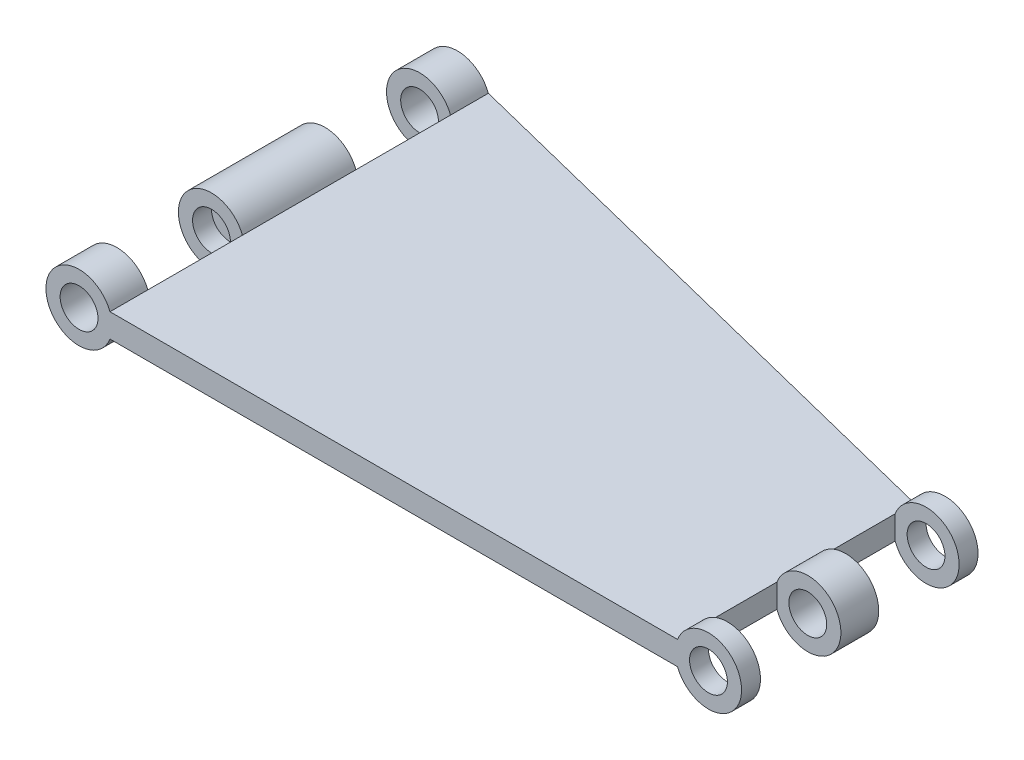
ISO-10303-21;
HEADER;
FILE_DESCRIPTION(('STEP AP214'),'2;1');
FILE_NAME('part.step','',(''),(''),'','','');
FILE_SCHEMA(('AUTOMOTIVE_DESIGN { 1 0 10303 214 1 1 1 1 }'));
ENDSEC;
DATA;
#1=APPLICATION_CONTEXT('core data for automotive mechanical design processes');
#2=APPLICATION_PROTOCOL_DEFINITION('international standard','automotive_design',2000,#1);
#3=PRODUCT_CONTEXT('',#1,'mechanical');
#4=PRODUCT('Part','Part','',(#3));
#5=PRODUCT_RELATED_PRODUCT_CATEGORY('part','',(#4));
#6=PRODUCT_DEFINITION_FORMATION('','',#4);
#7=PRODUCT_DEFINITION_CONTEXT('part definition',#1,'design');
#8=PRODUCT_DEFINITION('design','',#6,#7);
#9=PRODUCT_DEFINITION_SHAPE('','',#8);
#10=(LENGTH_UNIT() NAMED_UNIT(*) SI_UNIT(.MILLI.,.METRE.));
#11=(NAMED_UNIT(*) PLANE_ANGLE_UNIT() SI_UNIT($,.RADIAN.));
#12=(NAMED_UNIT(*) SI_UNIT($,.STERADIAN.) SOLID_ANGLE_UNIT());
#13=UNCERTAINTY_MEASURE_WITH_UNIT(LENGTH_MEASURE(1.E-05),#10,'distance_accuracy_value','');
#14=(GEOMETRIC_REPRESENTATION_CONTEXT(3) GLOBAL_UNCERTAINTY_ASSIGNED_CONTEXT((#13)) GLOBAL_UNIT_ASSIGNED_CONTEXT((#10,
#11,#12)) REPRESENTATION_CONTEXT('',''));
#15=CARTESIAN_POINT('',(0.,0.,0.));
#16=DIRECTION('',(0.,0.,1.));
#17=DIRECTION('',(1.,0.,0.));
#18=AXIS2_PLACEMENT_3D('',#15,#16,#17);
#19=CARTESIAN_POINT('',(-86.030948838144,2.5,-46.9344608879492));
#20=DIRECTION('',(0.,0.,1.));
#21=DIRECTION('',(1.,0.,0.));
#22=AXIS2_PLACEMENT_3D('',#19,#20,#21);
#23=CYLINDRICAL_SURFACE('',#22,1.5);
#24=CARTESIAN_POINT('',(-86.030948838144,2.5,1.0655391120508));
#25=DIRECTION('',(0.,0.,1.));
#26=DIRECTION('',(1.,0.,0.));
#27=AXIS2_PLACEMENT_3D('',#24,#25,#26);
#28=CIRCLE('',#27,1.5);
#29=CARTESIAN_POINT('',(-84.530948838144,2.5,1.0655391120508));
#30=VERTEX_POINT('',#29);
#31=EDGE_CURVE('E198',#30,#30,#28,.F.);
#32=ORIENTED_EDGE('',*,*,#31,.F.);
#33=EDGE_LOOP('',(#32));
#34=FACE_BOUND('',#33,.T.);
#35=CARTESIAN_POINT('',(-86.030948838144,2.5,-14.9344608879492));
#36=DIRECTION('',(0.,0.,-1.));
#37=DIRECTION('',(-1.,0.,0.));
#38=AXIS2_PLACEMENT_3D('',#35,#36,#37);
#39=CIRCLE('',#38,1.5);
#40=CARTESIAN_POINT('',(-87.530948838144,2.5,-14.9344608879492));
#41=VERTEX_POINT('',#40);
#42=EDGE_CURVE('E39',#41,#41,#39,.F.);
#43=ORIENTED_EDGE('',*,*,#42,.F.);
#44=EDGE_LOOP('',(#43));
#45=FACE_BOUND('',#44,.T.);
#46=ADVANCED_FACE('F35',(#34,#45),#23,.F.);
#47=CARTESIAN_POINT('',(47.045747992478,2.5,-16.9344608879492));
#48=DIRECTION('',(0.,0.,1.));
#49=DIRECTION('',(1.,0.,0.));
#50=AXIS2_PLACEMENT_3D('',#47,#48,#49);
#51=CYLINDRICAL_SURFACE('',#50,7.);
#52=DIRECTION('',(0.,0.,-1.));
#53=VECTOR('',#52,1.);
#54=CARTESIAN_POINT('',(40.507399577167,0.,33.0655391120508));
#55=LINE('',#54,#53);
#56=CARTESIAN_POINT('',(40.507399577167,0.,12.0655391120508));
#57=VERTEX_POINT('',#56);
#58=CARTESIAN_POINT('',(40.507399577167,0.,4.0655391120508));
#59=VERTEX_POINT('',#58);
#60=EDGE_CURVE('E405',#57,#59,#55,.T.);
#61=ORIENTED_EDGE('',*,*,#60,.T.);
#62=CARTESIAN_POINT('',(47.045747992478,2.5,4.0655391120508));
#63=DIRECTION('',(0.,0.,-1.));
#64=DIRECTION('',(-1.,0.,0.));
#65=AXIS2_PLACEMENT_3D('',#62,#63,#64);
#66=CIRCLE('',#65,7.);
#67=CARTESIAN_POINT('',(40.507399577167,5.00000000000001,4.0655391120508));
#68=VERTEX_POINT('',#67);
#69=EDGE_CURVE('E155',#59,#68,#66,.F.);
#70=ORIENTED_EDGE('',*,*,#69,.T.);
#71=DIRECTION('',(0.,0.,-1.));
#72=VECTOR('',#71,1.);
#73=CARTESIAN_POINT('',(40.507399577167,5.,33.0655391120508));
#74=LINE('',#73,#72);
#75=CARTESIAN_POINT('',(40.507399577167,5.00000000000001,12.0655391120508));
#76=VERTEX_POINT('',#75);
#77=EDGE_CURVE('E153',#76,#68,#74,.T.);
#78=ORIENTED_EDGE('',*,*,#77,.F.);
#79=CARTESIAN_POINT('',(47.045747992478,2.5,12.0655391120508));
#80=DIRECTION('',(0.,0.,1.));
#81=DIRECTION('',(1.,0.,0.));
#82=AXIS2_PLACEMENT_3D('',#79,#80,#81);
#83=CIRCLE('',#82,7.);
#84=EDGE_CURVE('E127',#76,#57,#83,.F.);
#85=ORIENTED_EDGE('',*,*,#84,.T.);
#86=EDGE_LOOP('',(#61,#70,#78,#85));
#87=FACE_BOUND('',#86,.T.);
#88=ADVANCED_FACE('F154',(#87),#51,.T.);
#89=CARTESIAN_POINT('',(47.045747992478,2.5,-12.9344608879492));
#90=DIRECTION('',(0.,0.,1.));
#91=DIRECTION('',(1.,0.,0.));
#92=AXIS2_PLACEMENT_3D('',#89,#90,#91);
#93=CIRCLE('',#92,7.);
#94=CARTESIAN_POINT('',(40.507399577167,5.00000000000001,-12.9344608879492));
#95=VERTEX_POINT('',#94);
#96=CARTESIAN_POINT('',(40.507399577167,0.,-12.9344608879492));
#97=VERTEX_POINT('',#96);
#98=EDGE_CURVE('E194',#95,#97,#93,.F.);
#99=ORIENTED_EDGE('',*,*,#98,.T.);
#100=CARTESIAN_POINT('',(40.507399577167,0.,-16.9344608879492));
#101=VERTEX_POINT('',#100);
#102=EDGE_CURVE('E180',#97,#101,#55,.T.);
#103=ORIENTED_EDGE('',*,*,#102,.T.);
#104=CARTESIAN_POINT('',(47.045747992478,2.5,-16.9344608879492));
#105=DIRECTION('',(0.,0.,1.));
#106=DIRECTION('',(1.,0.,0.));
#107=AXIS2_PLACEMENT_3D('',#104,#105,#106);
#108=CIRCLE('',#107,7.);
#109=CARTESIAN_POINT('',(40.507399577167,5.,-16.9344608879492));
#110=VERTEX_POINT('',#109);
#111=EDGE_CURVE('E243',#101,#110,#108,.T.);
#112=ORIENTED_EDGE('',*,*,#111,.T.);
#113=EDGE_CURVE('E165',#95,#110,#74,.T.);
#114=ORIENTED_EDGE('',*,*,#113,.F.);
#115=EDGE_LOOP('',(#99,#103,#112,#114));
#116=FACE_BOUND('',#115,.T.);
#117=ADVANCED_FACE('F323',(#116),#51,.T.);
#118=CARTESIAN_POINT('',(40.507399577167,0.,33.0655391120508));
#119=VERTEX_POINT('',#118);
#120=CARTESIAN_POINT('',(40.507399577167,0.,29.0655391120508));
#121=VERTEX_POINT('',#120);
#122=EDGE_CURVE('E181',#119,#121,#55,.T.);
#123=ORIENTED_EDGE('',*,*,#122,.T.);
#124=CARTESIAN_POINT('',(47.045747992478,2.5,29.0655391120508));
#125=DIRECTION('',(0.,0.,-1.));
#126=DIRECTION('',(-1.,0.,0.));
#127=AXIS2_PLACEMENT_3D('',#124,#125,#126);
#128=CIRCLE('',#127,7.);
#129=CARTESIAN_POINT('',(40.507399577167,5.00000000000001,29.0655391120508));
#130=VERTEX_POINT('',#129);
#131=EDGE_CURVE('E190',#121,#130,#128,.F.);
#132=ORIENTED_EDGE('',*,*,#131,.T.);
#133=CARTESIAN_POINT('',(40.507399577167,5.,33.0655391120508));
#134=VERTEX_POINT('',#133);
#135=EDGE_CURVE('E44',#134,#130,#74,.T.);
#136=ORIENTED_EDGE('',*,*,#135,.F.);
#137=CARTESIAN_POINT('',(47.045747992478,2.5,33.0655391120508));
#138=DIRECTION('',(0.,0.,1.));
#139=DIRECTION('',(1.,0.,0.));
#140=AXIS2_PLACEMENT_3D('',#137,#138,#139);
#141=CIRCLE('',#140,7.);
#142=EDGE_CURVE('E240',#119,#134,#141,.T.);
#143=ORIENTED_EDGE('',*,*,#142,.F.);
#144=EDGE_LOOP('',(#123,#132,#136,#143));
#145=FACE_BOUND('',#144,.T.);
#146=ADVANCED_FACE('F325',(#145),#51,.T.);
#147=CARTESIAN_POINT('',(47.045747992478,2.5,-16.9344608879492));
#148=DIRECTION('',(0.,0.,1.));
#149=DIRECTION('',(1.,0.,0.));
#150=AXIS2_PLACEMENT_3D('',#147,#148,#149);
#151=CYLINDRICAL_SURFACE('',#150,4.00000000000001);
#152=CARTESIAN_POINT('',(47.045747992478,2.5,-16.9344608879492));
#153=DIRECTION('',(0.,0.,1.));
#154=DIRECTION('',(1.,0.,0.));
#155=AXIS2_PLACEMENT_3D('',#152,#153,#154);
#156=CIRCLE('',#155,4.00000000000001);
#157=CARTESIAN_POINT('',(51.045747992478,2.5,-16.9344608879492));
#158=VERTEX_POINT('',#157);
#159=EDGE_CURVE('E237',#158,#158,#156,.T.);
#160=ORIENTED_EDGE('',*,*,#159,.F.);
#161=EDGE_LOOP('',(#160));
#162=FACE_BOUND('',#161,.T.);
#163=CARTESIAN_POINT('',(47.045747992478,2.5,-12.9344608879492));
#164=DIRECTION('',(0.,0.,1.));
#165=DIRECTION('',(1.,0.,0.));
#166=AXIS2_PLACEMENT_3D('',#163,#164,#165);
#167=CIRCLE('',#166,4.00000000000001);
#168=CARTESIAN_POINT('',(51.045747992478,2.5,-12.9344608879492));
#169=VERTEX_POINT('',#168);
#170=EDGE_CURVE('E191',#169,#169,#167,.F.);
#171=ORIENTED_EDGE('',*,*,#170,.F.);
#172=EDGE_LOOP('',(#171));
#173=FACE_BOUND('',#172,.T.);
#174=ADVANCED_FACE('F355',(#162,#173),#151,.F.);
#175=CARTESIAN_POINT('',(47.045747992478,2.5,33.0655391120508));
#176=DIRECTION('',(0.,0.,1.));
#177=DIRECTION('',(1.,0.,0.));
#178=AXIS2_PLACEMENT_3D('',#175,#176,#177);
#179=CIRCLE('',#178,4.00000000000001);
#180=CARTESIAN_POINT('',(51.045747992478,2.5,33.0655391120508));
#181=VERTEX_POINT('',#180);
#182=EDGE_CURVE('E236',#181,#181,#179,.T.);
#183=ORIENTED_EDGE('',*,*,#182,.T.);
#184=EDGE_LOOP('',(#183));
#185=FACE_BOUND('',#184,.T.);
#186=CARTESIAN_POINT('',(47.045747992478,2.5,29.0655391120508));
#187=DIRECTION('',(0.,0.,-1.));
#188=DIRECTION('',(-1.,0.,0.));
#189=AXIS2_PLACEMENT_3D('',#186,#187,#188);
#190=CIRCLE('',#189,4.00000000000001);
#191=CARTESIAN_POINT('',(43.045747992478,2.5,29.0655391120508));
#192=VERTEX_POINT('',#191);
#193=EDGE_CURVE('E137',#192,#192,#190,.F.);
#194=ORIENTED_EDGE('',*,*,#193,.F.);
#195=EDGE_LOOP('',(#194));
#196=FACE_BOUND('',#195,.T.);
#197=ADVANCED_FACE('F352',(#185,#196),#151,.F.);
#198=CARTESIAN_POINT('',(-86.030948838144,2.5,-46.9344608879492));
#199=DIRECTION('',(0.,0.,1.));
#200=DIRECTION('',(1.,0.,0.));
#201=AXIS2_PLACEMENT_3D('',#198,#199,#200);
#202=CYLINDRICAL_SURFACE('',#201,7.);
#203=DIRECTION('',(0.,0.,1.));
#204=VECTOR('',#203,1.);
#205=CARTESIAN_POINT('',(-79.492600422833,0.,-46.9344608879492));
#206=LINE('',#205,#204);
#207=CARTESIAN_POINT('',(-79.492600422833,0.,-46.9344608879492));
#208=VERTEX_POINT('',#207);
#209=CARTESIAN_POINT('',(-79.492600422833,0.,-38.9344608879492));
#210=VERTEX_POINT('',#209);
#211=EDGE_CURVE('E175',#208,#210,#206,.T.);
#212=ORIENTED_EDGE('',*,*,#211,.T.);
#213=CARTESIAN_POINT('',(-86.030948838144,2.5,-38.9344608879492));
#214=DIRECTION('',(0.,0.,1.));
#215=DIRECTION('',(1.,0.,0.));
#216=AXIS2_PLACEMENT_3D('',#213,#214,#215);
#217=CIRCLE('',#216,7.);
#218=CARTESIAN_POINT('',(-79.492600422833,5.,-38.9344608879492));
#219=VERTEX_POINT('',#218);
#220=EDGE_CURVE('E59',#210,#219,#217,.F.);
#221=ORIENTED_EDGE('',*,*,#220,.T.);
#222=DIRECTION('',(0.,0.,1.));
#223=VECTOR('',#222,1.);
#224=CARTESIAN_POINT('',(-79.492600422833,5.,-46.9344608879492));
#225=LINE('',#224,#223);
#226=CARTESIAN_POINT('',(-79.492600422833,5.,-46.9344608879492));
#227=VERTEX_POINT('',#226);
#228=EDGE_CURVE('E274',#227,#219,#225,.T.);
#229=ORIENTED_EDGE('',*,*,#228,.F.);
#230=CARTESIAN_POINT('',(-86.030948838144,2.5,-46.9344608879492));
#231=DIRECTION('',(0.,0.,1.));
#232=DIRECTION('',(1.,0.,0.));
#233=AXIS2_PLACEMENT_3D('',#230,#231,#232);
#234=CIRCLE('',#233,7.);
#235=EDGE_CURVE('E266',#227,#208,#234,.T.);
#236=ORIENTED_EDGE('',*,*,#235,.T.);
#237=EDGE_LOOP('',(#212,#221,#229,#236));
#238=FACE_BOUND('',#237,.T.);
#239=ADVANCED_FACE('F313',(#238),#202,.T.);
#240=CARTESIAN_POINT('',(-86.030948838144,2.5,-18.9344608879492));
#241=DIRECTION('',(0.,0.,1.));
#242=DIRECTION('',(1.,0.,0.));
#243=AXIS2_PLACEMENT_3D('',#240,#241,#242);
#244=CIRCLE('',#243,7.);
#245=CARTESIAN_POINT('',(-79.492600422833,0.,-18.9344608879492));
#246=VERTEX_POINT('',#245);
#247=CARTESIAN_POINT('',(-79.492600422833,5.,-18.9344608879492));
#248=VERTEX_POINT('',#247);
#249=EDGE_CURVE('E263',#246,#248,#244,.F.);
#250=ORIENTED_EDGE('',*,*,#249,.F.);
#251=CARTESIAN_POINT('',(-79.492600422833,0.,5.0655391120508));
#252=VERTEX_POINT('',#251);
#253=EDGE_CURVE('E292',#246,#252,#206,.T.);
#254=ORIENTED_EDGE('',*,*,#253,.T.);
#255=CARTESIAN_POINT('',(-86.030948838144,2.5,5.0655391120508));
#256=DIRECTION('',(0.,0.,1.));
#257=DIRECTION('',(1.,0.,0.));
#258=AXIS2_PLACEMENT_3D('',#255,#256,#257);
#259=CIRCLE('',#258,7.);
#260=CARTESIAN_POINT('',(-79.492600422833,5.,5.0655391120508));
#261=VERTEX_POINT('',#260);
#262=EDGE_CURVE('E260',#252,#261,#259,.F.);
#263=ORIENTED_EDGE('',*,*,#262,.T.);
#264=EDGE_CURVE('E278',#248,#261,#225,.T.);
#265=ORIENTED_EDGE('',*,*,#264,.F.);
#266=EDGE_LOOP('',(#250,#254,#263,#265));
#267=FACE_BOUND('',#266,.T.);
#268=ADVANCED_FACE('F289',(#267),#202,.T.);
#269=CARTESIAN_POINT('',(40.507399577167,5.,-16.9344608879492));
#270=DIRECTION('',(-0.242535625036333,0.,0.970142500145332));
#271=DIRECTION('',(0.970142500145332,0.,0.242535625036333));
#272=AXIS2_PLACEMENT_3D('',#269,#270,#271);
#273=PLANE('',#272);
#274=DIRECTION('',(-0.970142500145332,0.,-0.242535625036333));
#275=VECTOR('',#274,1.);
#276=CARTESIAN_POINT('',(40.507399577167,0.,-16.9344608879492));
#277=LINE('',#276,#275);
#278=EDGE_CURVE('E170',#101,#208,#277,.T.);
#279=ORIENTED_EDGE('',*,*,#278,.T.);
#280=CARTESIAN_POINT('',(-86.030948838144,2.5,-48.5690479917769));
#281=DIRECTION('',(-0.242535625036333,0.,0.970142500145332));
#282=DIRECTION('',(0.970142500145332,0.,0.242535625036333));
#283=AXIS2_PLACEMENT_3D('',#280,#281,#282);
#284=ELLIPSE('',#283,7.21543484483091,7.);
#285=EDGE_CURVE('E174',#208,#227,#284,.T.);
#286=ORIENTED_EDGE('',*,*,#285,.T.);
#287=DIRECTION('',(-0.970142500145332,0.,-0.242535625036333));
#288=VECTOR('',#287,1.);
#289=CARTESIAN_POINT('',(40.507399577167,5.,-16.9344608879492));
#290=LINE('',#289,#288);
#291=EDGE_CURVE('E183',#110,#227,#290,.T.);
#292=ORIENTED_EDGE('',*,*,#291,.F.);
#293=DIRECTION('',(0.,-1.,0.));
#294=VECTOR('',#293,1.);
#295=CARTESIAN_POINT('',(40.507399577167,5.,-16.9344608879492));
#296=LINE('',#295,#294);
#297=EDGE_CURVE('E11',#110,#101,#296,.T.);
#298=ORIENTED_EDGE('',*,*,#297,.T.);
#299=EDGE_LOOP('',(#279,#286,#292,#298));
#300=FACE_BOUND('',#299,.T.);
#301=ADVANCED_FACE('F37',(#300),#273,.F.);
#302=CARTESIAN_POINT('',(-79.492600422833,5.,33.0655391120508));
#303=DIRECTION('',(0.,0.,-1.));
#304=DIRECTION('',(-1.,0.,0.));
#305=AXIS2_PLACEMENT_3D('',#302,#303,#304);
#306=PLANE('',#305);
#307=CARTESIAN_POINT('',(-86.030948838144,2.5,33.0655391120508));
#308=DIRECTION('',(0.,0.,1.));
#309=DIRECTION('',(1.,0.,0.));
#310=AXIS2_PLACEMENT_3D('',#307,#308,#309);
#311=CIRCLE('',#310,4.00000000000001);
#312=CARTESIAN_POINT('',(-82.030948838144,2.5,33.0655391120508));
#313=VERTEX_POINT('',#312);
#314=EDGE_CURVE('E222',#313,#313,#311,.T.);
#315=ORIENTED_EDGE('',*,*,#314,.F.);
#316=EDGE_LOOP('',(#315));
#317=FACE_BOUND('',#316,.T.);
#318=DIRECTION('',(1.,0.,0.));
#319=VECTOR('',#318,1.);
#320=CARTESIAN_POINT('',(-79.492600422833,0.,33.0655391120508));
#321=LINE('',#320,#319);
#322=CARTESIAN_POINT('',(-79.492600422833,0.,33.0655391120508));
#323=VERTEX_POINT('',#322);
#324=EDGE_CURVE('E177',#323,#119,#321,.T.);
#325=ORIENTED_EDGE('',*,*,#324,.T.);
#326=ORIENTED_EDGE('',*,*,#142,.T.);
#327=DIRECTION('',(1.,0.,0.));
#328=VECTOR('',#327,1.);
#329=CARTESIAN_POINT('',(-79.492600422833,5.,33.0655391120508));
#330=LINE('',#329,#328);
#331=CARTESIAN_POINT('',(-79.492600422833,5.,33.0655391120508));
#332=VERTEX_POINT('',#331);
#333=EDGE_CURVE('E168',#332,#134,#330,.T.);
#334=ORIENTED_EDGE('',*,*,#333,.F.);
#335=CARTESIAN_POINT('',(-86.030948838144,2.5,33.0655391120508));
#336=DIRECTION('',(0.,0.,1.));
#337=DIRECTION('',(1.,0.,0.));
#338=AXIS2_PLACEMENT_3D('',#335,#336,#337);
#339=CIRCLE('',#338,7.);
#340=EDGE_CURVE('E265',#332,#323,#339,.T.);
#341=ORIENTED_EDGE('',*,*,#340,.T.);
#342=EDGE_LOOP('',(#325,#326,#334,#341));
#343=FACE_BOUND('',#342,.T.);
#344=ORIENTED_EDGE('',*,*,#182,.F.);
#345=EDGE_LOOP('',(#344));
#346=FACE_BOUND('',#345,.T.);
#347=ADVANCED_FACE('F336',(#317,#343,#346),#306,.F.);
#348=CARTESIAN_POINT('',(0.,5.,0.));
#349=DIRECTION('',(0.,1.,0.));
#350=DIRECTION('',(0.,0.,1.));
#351=AXIS2_PLACEMENT_3D('',#348,#349,#350);
#352=PLANE('',#351);
#353=ORIENTED_EDGE('',*,*,#291,.T.);
#354=ORIENTED_EDGE('',*,*,#228,.T.);
#355=EDGE_CURVE('E276',#219,#248,#225,.T.);
#356=ORIENTED_EDGE('',*,*,#355,.T.);
#357=ORIENTED_EDGE('',*,*,#264,.T.);
#358=CARTESIAN_POINT('',(-79.492600422833,5.,25.0655391120508));
#359=VERTEX_POINT('',#358);
#360=EDGE_CURVE('E279',#261,#359,#225,.T.);
#361=ORIENTED_EDGE('',*,*,#360,.T.);
#362=EDGE_CURVE('E273',#359,#332,#225,.T.);
#363=ORIENTED_EDGE('',*,*,#362,.T.);
#364=ORIENTED_EDGE('',*,*,#333,.T.);
#365=ORIENTED_EDGE('',*,*,#135,.T.);
#366=EDGE_CURVE('E145',#130,#76,#74,.T.);
#367=ORIENTED_EDGE('',*,*,#366,.T.);
#368=ORIENTED_EDGE('',*,*,#77,.T.);
#369=EDGE_CURVE('E159',#68,#95,#74,.T.);
#370=ORIENTED_EDGE('',*,*,#369,.T.);
#371=ORIENTED_EDGE('',*,*,#113,.T.);
#372=EDGE_LOOP('',(#353,#354,#356,#357,#361,#363,#364,#365,#367,#368,#370,#371));
#373=FACE_BOUND('',#372,.T.);
#374=ADVANCED_FACE('F163',(#373),#352,.T.);
#375=CARTESIAN_POINT('',(0.,0.,0.));
#376=DIRECTION('',(0.,1.,0.));
#377=DIRECTION('',(0.,0.,1.));
#378=AXIS2_PLACEMENT_3D('',#375,#376,#377);
#379=PLANE('',#378);
#380=ORIENTED_EDGE('',*,*,#278,.F.);
#381=ORIENTED_EDGE('',*,*,#102,.F.);
#382=EDGE_CURVE('E406',#59,#97,#55,.T.);
#383=ORIENTED_EDGE('',*,*,#382,.F.);
#384=ORIENTED_EDGE('',*,*,#60,.F.);
#385=EDGE_CURVE('E148',#121,#57,#55,.T.);
#386=ORIENTED_EDGE('',*,*,#385,.F.);
#387=ORIENTED_EDGE('',*,*,#122,.F.);
#388=ORIENTED_EDGE('',*,*,#324,.F.);
#389=CARTESIAN_POINT('',(-79.492600422833,0.,25.0655391120508));
#390=VERTEX_POINT('',#389);
#391=EDGE_CURVE('E173',#390,#323,#206,.T.);
#392=ORIENTED_EDGE('',*,*,#391,.F.);
#393=EDGE_CURVE('E398',#252,#390,#206,.T.);
#394=ORIENTED_EDGE('',*,*,#393,.F.);
#395=ORIENTED_EDGE('',*,*,#253,.F.);
#396=EDGE_CURVE('E178',#210,#246,#206,.T.);
#397=ORIENTED_EDGE('',*,*,#396,.F.);
#398=ORIENTED_EDGE('',*,*,#211,.F.);
#399=EDGE_LOOP('',(#380,#381,#383,#384,#386,#387,#388,#392,#394,#395,#397,#398));
#400=FACE_BOUND('',#399,.T.);
#401=ADVANCED_FACE('F335',(#400),#379,.F.);
#402=ORIENTED_EDGE('',*,*,#285,.F.);
#403=EDGE_CURVE('E269',#208,#227,#234,.T.);
#404=ORIENTED_EDGE('',*,*,#403,.T.);
#405=EDGE_LOOP('',(#402,#404));
#406=FACE_BOUND('',#405,.T.);
#407=ADVANCED_FACE('F314',(#406),#202,.T.);
#408=CARTESIAN_POINT('',(-86.030948838144,2.5,-46.9344608879492));
#409=DIRECTION('',(0.,0.,1.));
#410=DIRECTION('',(1.,0.,0.));
#411=AXIS2_PLACEMENT_3D('',#408,#409,#410);
#412=PLANE('',#411);
#413=CARTESIAN_POINT('',(-86.030948838144,2.5,-46.9344608879492));
#414=DIRECTION('',(0.,0.,-1.));
#415=DIRECTION('',(-1.,0.,0.));
#416=AXIS2_PLACEMENT_3D('',#413,#414,#415);
#417=CIRCLE('',#416,4.00000000000001);
#418=CARTESIAN_POINT('',(-90.030948838144,2.5,-46.9344608879492));
#419=VERTEX_POINT('',#418);
#420=EDGE_CURVE('E213',#419,#419,#417,.T.);
#421=ORIENTED_EDGE('',*,*,#420,.F.);
#422=EDGE_LOOP('',(#421));
#423=FACE_BOUND('',#422,.T.);
#424=ORIENTED_EDGE('',*,*,#235,.F.);
#425=ORIENTED_EDGE('',*,*,#403,.F.);
#426=EDGE_LOOP('',(#424,#425));
#427=FACE_BOUND('',#426,.T.);
#428=ADVANCED_FACE('F310',(#423,#427),#412,.F.);
#429=CARTESIAN_POINT('',(-86.030948838144,2.5,25.0655391120508));
#430=DIRECTION('',(0.,0.,1.));
#431=DIRECTION('',(1.,0.,0.));
#432=AXIS2_PLACEMENT_3D('',#429,#430,#431);
#433=CIRCLE('',#432,7.);
#434=EDGE_CURVE('E51',#390,#359,#433,.F.);
#435=ORIENTED_EDGE('',*,*,#434,.F.);
#436=ORIENTED_EDGE('',*,*,#391,.T.);
#437=ORIENTED_EDGE('',*,*,#340,.F.);
#438=ORIENTED_EDGE('',*,*,#362,.F.);
#439=EDGE_LOOP('',(#435,#436,#437,#438));
#440=FACE_BOUND('',#439,.T.);
#441=ADVANCED_FACE('F301',(#440),#202,.T.);
#442=CARTESIAN_POINT('',(-79.492600422833,85.,5.0655391120508));
#443=DIRECTION('',(0.,0.,1.));
#444=DIRECTION('',(1.,0.,0.));
#445=AXIS2_PLACEMENT_3D('',#442,#443,#444);
#446=PLANE('',#445);
#447=CARTESIAN_POINT('',(-86.030948838144,2.5,5.06553911205079));
#448=DIRECTION('',(0.,0.,1.));
#449=DIRECTION('',(1.,0.,0.));
#450=AXIS2_PLACEMENT_3D('',#447,#448,#449);
#451=CIRCLE('',#450,4.00000000000001);
#452=CARTESIAN_POINT('',(-82.030948838144,2.5,5.0655391120508));
#453=VERTEX_POINT('',#452);
#454=EDGE_CURVE('E150',#453,#453,#451,.T.);
#455=ORIENTED_EDGE('',*,*,#454,.F.);
#456=EDGE_LOOP('',(#455));
#457=FACE_BOUND('',#456,.T.);
#458=DIRECTION('',(0.,-1.,0.));
#459=VECTOR('',#458,1.);
#460=CARTESIAN_POINT('',(-79.492600422833,85.,5.0655391120508));
#461=LINE('',#460,#459);
#462=EDGE_CURVE('E255',#261,#252,#461,.T.);
#463=ORIENTED_EDGE('',*,*,#462,.F.);
#464=ORIENTED_EDGE('',*,*,#262,.F.);
#465=EDGE_LOOP('',(#463,#464));
#466=FACE_BOUND('',#465,.T.);
#467=ADVANCED_FACE('F298',(#457,#466),#446,.T.);
#468=CARTESIAN_POINT('',(-79.492600422833,85.,25.0655391120508));
#469=DIRECTION('',(0.,0.,1.));
#470=DIRECTION('',(1.,0.,0.));
#471=AXIS2_PLACEMENT_3D('',#468,#469,#470);
#472=PLANE('',#471);
#473=CARTESIAN_POINT('',(-86.030948838144,2.5,25.0655391120508));
#474=DIRECTION('',(0.,0.,1.));
#475=DIRECTION('',(1.,0.,0.));
#476=AXIS2_PLACEMENT_3D('',#473,#474,#475);
#477=CIRCLE('',#476,4.00000000000001);
#478=CARTESIAN_POINT('',(-82.030948838144,2.5,25.0655391120508));
#479=VERTEX_POINT('',#478);
#480=EDGE_CURVE('E201',#479,#479,#477,.T.);
#481=ORIENTED_EDGE('',*,*,#480,.T.);
#482=EDGE_LOOP('',(#481));
#483=FACE_BOUND('',#482,.T.);
#484=ORIENTED_EDGE('',*,*,#434,.T.);
#485=DIRECTION('',(0.,-1.,0.));
#486=VECTOR('',#485,1.);
#487=CARTESIAN_POINT('',(-79.492600422833,85.,25.0655391120508));
#488=LINE('',#487,#486);
#489=EDGE_CURVE('E246',#359,#390,#488,.T.);
#490=ORIENTED_EDGE('',*,*,#489,.T.);
#491=EDGE_LOOP('',(#484,#490));
#492=FACE_BOUND('',#491,.T.);
#493=ADVANCED_FACE('F300',(#483,#492),#472,.F.);
#494=CARTESIAN_POINT('',(-79.492600422833,85.,25.0655391120508));
#495=DIRECTION('',(-1.,0.,0.));
#496=DIRECTION('',(0.,0.,1.));
#497=AXIS2_PLACEMENT_3D('',#494,#495,#496);
#498=PLANE('',#497);
#499=ORIENTED_EDGE('',*,*,#489,.F.);
#500=ORIENTED_EDGE('',*,*,#360,.F.);
#501=ORIENTED_EDGE('',*,*,#462,.T.);
#502=ORIENTED_EDGE('',*,*,#393,.T.);
#503=EDGE_LOOP('',(#499,#500,#501,#502));
#504=FACE_BOUND('',#503,.T.);
#505=ADVANCED_FACE('F296',(#504),#498,.T.);
#506=CARTESIAN_POINT('',(-79.492600422833,85.,-18.9344608879492));
#507=DIRECTION('',(0.,0.,1.));
#508=DIRECTION('',(1.,0.,0.));
#509=AXIS2_PLACEMENT_3D('',#506,#507,#508);
#510=PLANE('',#509);
#511=CARTESIAN_POINT('',(-86.030948838144,2.5,-18.9344608879492));
#512=DIRECTION('',(0.,0.,1.));
#513=DIRECTION('',(1.,0.,0.));
#514=AXIS2_PLACEMENT_3D('',#511,#512,#513);
#515=CIRCLE('',#514,4.00000000000001);
#516=CARTESIAN_POINT('',(-82.030948838144,2.5,-18.9344608879492));
#517=VERTEX_POINT('',#516);
#518=EDGE_CURVE('E206',#517,#517,#515,.T.);
#519=ORIENTED_EDGE('',*,*,#518,.T.);
#520=EDGE_LOOP('',(#519));
#521=FACE_BOUND('',#520,.T.);
#522=ORIENTED_EDGE('',*,*,#249,.T.);
#523=DIRECTION('',(0.,-1.,0.));
#524=VECTOR('',#523,1.);
#525=CARTESIAN_POINT('',(-79.492600422833,85.,-18.9344608879492));
#526=LINE('',#525,#524);
#527=EDGE_CURVE('E249',#248,#246,#526,.T.);
#528=ORIENTED_EDGE('',*,*,#527,.T.);
#529=EDGE_LOOP('',(#522,#528));
#530=FACE_BOUND('',#529,.T.);
#531=ADVANCED_FACE('F387',(#521,#530),#510,.F.);
#532=CARTESIAN_POINT('',(-79.492600422833,85.,-38.9344608879492));
#533=DIRECTION('',(0.,0.,1.));
#534=DIRECTION('',(1.,0.,0.));
#535=AXIS2_PLACEMENT_3D('',#532,#533,#534);
#536=PLANE('',#535);
#537=CARTESIAN_POINT('',(-86.030948838144,2.5,-38.9344608879492));
#538=DIRECTION('',(0.,0.,1.));
#539=DIRECTION('',(1.,0.,0.));
#540=AXIS2_PLACEMENT_3D('',#537,#538,#539);
#541=CIRCLE('',#540,4.00000000000001);
#542=CARTESIAN_POINT('',(-82.030948838144,2.5,-38.9344608879492));
#543=VERTEX_POINT('',#542);
#544=EDGE_CURVE('E204',#543,#543,#541,.T.);
#545=ORIENTED_EDGE('',*,*,#544,.F.);
#546=EDGE_LOOP('',(#545));
#547=FACE_BOUND('',#546,.T.);
#548=DIRECTION('',(0.,-1.,0.));
#549=VECTOR('',#548,1.);
#550=CARTESIAN_POINT('',(-79.492600422833,85.,-38.9344608879492));
#551=LINE('',#550,#549);
#552=EDGE_CURVE('E252',#219,#210,#551,.T.);
#553=ORIENTED_EDGE('',*,*,#552,.F.);
#554=ORIENTED_EDGE('',*,*,#220,.F.);
#555=EDGE_LOOP('',(#553,#554));
#556=FACE_BOUND('',#555,.T.);
#557=ADVANCED_FACE('F384',(#547,#556),#536,.T.);
#558=CARTESIAN_POINT('',(-79.492600422833,85.,-38.9344608879492));
#559=DIRECTION('',(1.,0.,0.));
#560=DIRECTION('',(0.,0.,-1.));
#561=AXIS2_PLACEMENT_3D('',#558,#559,#560);
#562=PLANE('',#561);
#563=ORIENTED_EDGE('',*,*,#355,.F.);
#564=ORIENTED_EDGE('',*,*,#552,.T.);
#565=ORIENTED_EDGE('',*,*,#396,.T.);
#566=ORIENTED_EDGE('',*,*,#527,.F.);
#567=EDGE_LOOP('',(#563,#564,#565,#566));
#568=FACE_BOUND('',#567,.T.);
#569=ADVANCED_FACE('F370',(#568),#562,.F.);
#570=CARTESIAN_POINT('',(47.045747992478,2.5,-16.9344608879492));
#571=DIRECTION('',(0.,0.,1.));
#572=DIRECTION('',(1.,0.,0.));
#573=AXIS2_PLACEMENT_3D('',#570,#571,#572);
#574=PLANE('',#573);
#575=ORIENTED_EDGE('',*,*,#159,.T.);
#576=EDGE_LOOP('',(#575));
#577=FACE_BOUND('',#576,.T.);
#578=ORIENTED_EDGE('',*,*,#111,.F.);
#579=ORIENTED_EDGE('',*,*,#297,.F.);
#580=EDGE_LOOP('',(#578,#579));
#581=FACE_BOUND('',#580,.T.);
#582=ADVANCED_FACE('F362',(#577,#581),#574,.F.);
#583=CARTESIAN_POINT('',(40.507399577167,55.,29.0655391120508));
#584=DIRECTION('',(0.,0.,-1.));
#585=DIRECTION('',(-1.,0.,0.));
#586=AXIS2_PLACEMENT_3D('',#583,#584,#585);
#587=PLANE('',#586);
#588=DIRECTION('',(0.,-1.,0.));
#589=VECTOR('',#588,1.);
#590=CARTESIAN_POINT('',(40.507399577167,55.,29.0655391120508));
#591=LINE('',#590,#589);
#592=EDGE_CURVE('E149',#130,#121,#591,.T.);
#593=ORIENTED_EDGE('',*,*,#592,.F.);
#594=ORIENTED_EDGE('',*,*,#131,.F.);
#595=EDGE_LOOP('',(#593,#594));
#596=FACE_BOUND('',#595,.T.);
#597=ORIENTED_EDGE('',*,*,#193,.T.);
#598=EDGE_LOOP('',(#597));
#599=FACE_BOUND('',#598,.T.);
#600=ADVANCED_FACE('F360',(#596,#599),#587,.T.);
#601=CARTESIAN_POINT('',(40.507399577167,55.,12.0655391120508));
#602=DIRECTION('',(0.,0.,1.));
#603=DIRECTION('',(1.,0.,0.));
#604=AXIS2_PLACEMENT_3D('',#601,#602,#603);
#605=PLANE('',#604);
#606=ORIENTED_EDGE('',*,*,#84,.F.);
#607=DIRECTION('',(0.,-1.,0.));
#608=VECTOR('',#607,1.);
#609=CARTESIAN_POINT('',(40.507399577167,55.,12.0655391120508));
#610=LINE('',#609,#608);
#611=EDGE_CURVE('E131',#76,#57,#610,.T.);
#612=ORIENTED_EDGE('',*,*,#611,.T.);
#613=EDGE_LOOP('',(#606,#612));
#614=FACE_BOUND('',#613,.T.);
#615=CARTESIAN_POINT('',(47.045747992478,2.5,12.0655391120508));
#616=DIRECTION('',(0.,0.,1.));
#617=DIRECTION('',(1.,0.,0.));
#618=AXIS2_PLACEMENT_3D('',#615,#616,#617);
#619=CIRCLE('',#618,4.00000000000001);
#620=CARTESIAN_POINT('',(51.045747992478,2.5,12.0655391120508));
#621=VERTEX_POINT('',#620);
#622=EDGE_CURVE('E138',#621,#621,#619,.F.);
#623=ORIENTED_EDGE('',*,*,#622,.T.);
#624=EDGE_LOOP('',(#623));
#625=FACE_BOUND('',#624,.T.);
#626=ADVANCED_FACE('F129',(#614,#625),#605,.T.);
#627=CARTESIAN_POINT('',(40.507399577167,55.,29.0655391120508));
#628=DIRECTION('',(1.,0.,0.));
#629=DIRECTION('',(0.,0.,-1.));
#630=AXIS2_PLACEMENT_3D('',#627,#628,#629);
#631=PLANE('',#630);
#632=ORIENTED_EDGE('',*,*,#592,.T.);
#633=ORIENTED_EDGE('',*,*,#385,.T.);
#634=ORIENTED_EDGE('',*,*,#611,.F.);
#635=ORIENTED_EDGE('',*,*,#366,.F.);
#636=EDGE_LOOP('',(#632,#633,#634,#635));
#637=FACE_BOUND('',#636,.T.);
#638=ADVANCED_FACE('F143',(#637),#631,.T.);
#639=CARTESIAN_POINT('',(40.507399577167,55.,4.0655391120508));
#640=DIRECTION('',(0.,0.,-1.));
#641=DIRECTION('',(-1.,0.,0.));
#642=AXIS2_PLACEMENT_3D('',#639,#640,#641);
#643=PLANE('',#642);
#644=DIRECTION('',(0.,-1.,0.));
#645=VECTOR('',#644,1.);
#646=CARTESIAN_POINT('',(40.507399577167,55.,4.0655391120508));
#647=LINE('',#646,#645);
#648=EDGE_CURVE('E187',#68,#59,#647,.T.);
#649=ORIENTED_EDGE('',*,*,#648,.F.);
#650=ORIENTED_EDGE('',*,*,#69,.F.);
#651=EDGE_LOOP('',(#649,#650));
#652=FACE_BOUND('',#651,.T.);
#653=CARTESIAN_POINT('',(47.045747992478,2.5,4.0655391120508));
#654=DIRECTION('',(0.,0.,-1.));
#655=DIRECTION('',(-1.,0.,0.));
#656=AXIS2_PLACEMENT_3D('',#653,#654,#655);
#657=CIRCLE('',#656,4.00000000000001);
#658=CARTESIAN_POINT('',(43.045747992478,2.5,4.0655391120508));
#659=VERTEX_POINT('',#658);
#660=EDGE_CURVE('E195',#659,#659,#657,.F.);
#661=ORIENTED_EDGE('',*,*,#660,.T.);
#662=EDGE_LOOP('',(#661));
#663=FACE_BOUND('',#662,.T.);
#664=ADVANCED_FACE('F376',(#652,#663),#643,.T.);
#665=CARTESIAN_POINT('',(40.507399577167,55.,-12.9344608879492));
#666=DIRECTION('',(0.,0.,1.));
#667=DIRECTION('',(1.,0.,0.));
#668=AXIS2_PLACEMENT_3D('',#665,#666,#667);
#669=PLANE('',#668);
#670=ORIENTED_EDGE('',*,*,#98,.F.);
#671=DIRECTION('',(0.,-1.,0.));
#672=VECTOR('',#671,1.);
#673=CARTESIAN_POINT('',(40.507399577167,55.,-12.9344608879492));
#674=LINE('',#673,#672);
#675=EDGE_CURVE('E227',#95,#97,#674,.T.);
#676=ORIENTED_EDGE('',*,*,#675,.T.);
#677=EDGE_LOOP('',(#670,#676));
#678=FACE_BOUND('',#677,.T.);
#679=ORIENTED_EDGE('',*,*,#170,.T.);
#680=EDGE_LOOP('',(#679));
#681=FACE_BOUND('',#680,.T.);
#682=ADVANCED_FACE('F589',(#678,#681),#669,.T.);
#683=CARTESIAN_POINT('',(40.507399577167,55.,-12.9344608879492));
#684=DIRECTION('',(1.,0.,0.));
#685=DIRECTION('',(0.,0.,-1.));
#686=AXIS2_PLACEMENT_3D('',#683,#684,#685);
#687=PLANE('',#686);
#688=ORIENTED_EDGE('',*,*,#648,.T.);
#689=ORIENTED_EDGE('',*,*,#382,.T.);
#690=ORIENTED_EDGE('',*,*,#675,.F.);
#691=ORIENTED_EDGE('',*,*,#369,.F.);
#692=EDGE_LOOP('',(#688,#689,#690,#691));
#693=FACE_BOUND('',#692,.T.);
#694=ADVANCED_FACE('F379',(#693),#687,.T.);
#695=ORIENTED_EDGE('',*,*,#622,.F.);
#696=EDGE_LOOP('',(#695));
#697=FACE_BOUND('',#696,.T.);
#698=ORIENTED_EDGE('',*,*,#660,.F.);
#699=EDGE_LOOP('',(#698));
#700=FACE_BOUND('',#699,.T.);
#701=ADVANCED_FACE('F357',(#697,#700),#151,.F.);
#702=CARTESIAN_POINT('',(-86.030948838144,2.5,1.0655391120508));
#703=DIRECTION('',(0.,0.,1.));
#704=DIRECTION('',(1.,0.,0.));
#705=AXIS2_PLACEMENT_3D('',#702,#703,#704);
#706=PLANE('',#705);
#707=CARTESIAN_POINT('',(-86.030948838144,2.5,1.0655391120508));
#708=DIRECTION('',(0.,0.,1.));
#709=DIRECTION('',(1.,0.,0.));
#710=AXIS2_PLACEMENT_3D('',#707,#708,#709);
#711=CIRCLE('',#710,4.00000000000001);
#712=CARTESIAN_POINT('',(-82.030948838144,2.5,1.0655391120508));
#713=VERTEX_POINT('',#712);
#714=EDGE_CURVE('E202',#713,#713,#711,.T.);
#715=ORIENTED_EDGE('',*,*,#714,.T.);
#716=EDGE_LOOP('',(#715));
#717=FACE_BOUND('',#716,.T.);
#718=ORIENTED_EDGE('',*,*,#31,.T.);
#719=EDGE_LOOP('',(#718));
#720=FACE_BOUND('',#719,.T.);
#721=ADVANCED_FACE('F378',(#717,#720),#706,.T.);
#722=CARTESIAN_POINT('',(-86.030948838144,2.5,1.0655391120508));
#723=DIRECTION('',(0.,0.,1.));
#724=DIRECTION('',(1.,0.,0.));
#725=AXIS2_PLACEMENT_3D('',#722,#723,#724);
#726=CYLINDRICAL_SURFACE('',#725,4.00000000000001);
#727=ORIENTED_EDGE('',*,*,#454,.T.);
#728=EDGE_LOOP('',(#727));
#729=FACE_BOUND('',#728,.T.);
#730=ORIENTED_EDGE('',*,*,#714,.F.);
#731=EDGE_LOOP('',(#730));
#732=FACE_BOUND('',#731,.T.);
#733=ADVANCED_FACE('F518',(#729,#732),#726,.F.);
#734=ORIENTED_EDGE('',*,*,#314,.T.);
#735=EDGE_LOOP('',(#734));
#736=FACE_BOUND('',#735,.T.);
#737=ORIENTED_EDGE('',*,*,#480,.F.);
#738=EDGE_LOOP('',(#737));
#739=FACE_BOUND('',#738,.T.);
#740=ADVANCED_FACE('F529',(#736,#739),#726,.F.);
#741=CARTESIAN_POINT('',(-86.030948838144,2.5,-14.9344608879492));
#742=DIRECTION('',(0.,0.,-1.));
#743=DIRECTION('',(-1.,0.,0.));
#744=AXIS2_PLACEMENT_3D('',#741,#742,#743);
#745=CYLINDRICAL_SURFACE('',#744,4.00000000000001);
#746=ORIENTED_EDGE('',*,*,#544,.T.);
#747=EDGE_LOOP('',(#746));
#748=FACE_BOUND('',#747,.T.);
#749=ORIENTED_EDGE('',*,*,#420,.T.);
#750=EDGE_LOOP('',(#749));
#751=FACE_BOUND('',#750,.T.);
#752=ADVANCED_FACE('F538',(#748,#751),#745,.F.);
#753=CARTESIAN_POINT('',(-86.030948838144,2.5,-14.9344608879492));
#754=DIRECTION('',(0.,0.,-1.));
#755=DIRECTION('',(-1.,0.,0.));
#756=AXIS2_PLACEMENT_3D('',#753,#754,#755);
#757=PLANE('',#756);
#758=CARTESIAN_POINT('',(-86.030948838144,2.5,-14.9344608879492));
#759=DIRECTION('',(0.,0.,-1.));
#760=DIRECTION('',(-1.,0.,0.));
#761=AXIS2_PLACEMENT_3D('',#758,#759,#760);
#762=CIRCLE('',#761,4.00000000000001);
#763=CARTESIAN_POINT('',(-90.030948838144,2.5,-14.9344608879492));
#764=VERTEX_POINT('',#763);
#765=EDGE_CURVE('E207',#764,#764,#762,.T.);
#766=ORIENTED_EDGE('',*,*,#765,.T.);
#767=EDGE_LOOP('',(#766));
#768=FACE_BOUND('',#767,.T.);
#769=ORIENTED_EDGE('',*,*,#42,.T.);
#770=EDGE_LOOP('',(#769));
#771=FACE_BOUND('',#770,.T.);
#772=ADVANCED_FACE('F566',(#768,#771),#757,.T.);
#773=ORIENTED_EDGE('',*,*,#765,.F.);
#774=EDGE_LOOP('',(#773));
#775=FACE_BOUND('',#774,.T.);
#776=ORIENTED_EDGE('',*,*,#518,.F.);
#777=EDGE_LOOP('',(#776));
#778=FACE_BOUND('',#777,.T.);
#779=ADVANCED_FACE('F568',(#775,#778),#745,.F.);
#780=CLOSED_SHELL('',(#46,#88,#117,#146,#174,#197,#239,#268,#301,#347,#374,#401,#407,#428,#441,
#467,#493,#505,#531,#557,#569,#582,#600,#626,#638,#664,#682,#694,#701,#721,#733,#740,#752,#772,#779));
#781=MANIFOLD_SOLID_BREP('B2',#780);
#782=ADVANCED_BREP_SHAPE_REPRESENTATION('',(#18,#781),#14);
#783=SHAPE_DEFINITION_REPRESENTATION(#9,#782);
ENDSEC;
END-ISO-10303-21;
